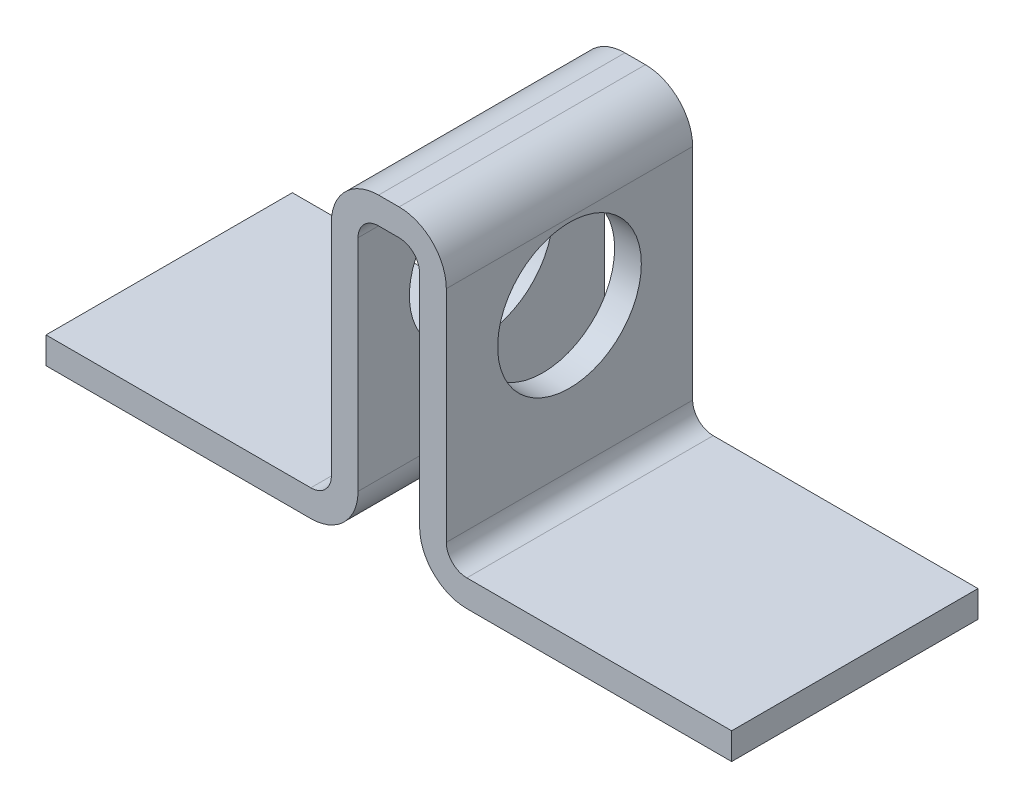
ISO-10303-21;
HEADER;
FILE_DESCRIPTION(('STEP AP214'),'2;1');
FILE_NAME('part.step','',(''),(''),'','','');
FILE_SCHEMA(('AUTOMOTIVE_DESIGN { 1 0 10303 214 1 1 1 1 }'));
ENDSEC;
DATA;
#1=APPLICATION_CONTEXT('core data for automotive mechanical design processes');
#2=APPLICATION_PROTOCOL_DEFINITION('international standard','automotive_design',2000,#1);
#3=PRODUCT_CONTEXT('',#1,'mechanical');
#4=PRODUCT('Part','Part','',(#3));
#5=PRODUCT_RELATED_PRODUCT_CATEGORY('part','',(#4));
#6=PRODUCT_DEFINITION_FORMATION('','',#4);
#7=PRODUCT_DEFINITION_CONTEXT('part definition',#1,'design');
#8=PRODUCT_DEFINITION('design','',#6,#7);
#9=PRODUCT_DEFINITION_SHAPE('','',#8);
#10=(LENGTH_UNIT() NAMED_UNIT(*) SI_UNIT(.MILLI.,.METRE.));
#11=(NAMED_UNIT(*) PLANE_ANGLE_UNIT() SI_UNIT($,.RADIAN.));
#12=(NAMED_UNIT(*) SI_UNIT($,.STERADIAN.) SOLID_ANGLE_UNIT());
#13=UNCERTAINTY_MEASURE_WITH_UNIT(LENGTH_MEASURE(1.E-05),#10,'distance_accuracy_value','');
#14=(GEOMETRIC_REPRESENTATION_CONTEXT(3) GLOBAL_UNCERTAINTY_ASSIGNED_CONTEXT((#13)) GLOBAL_UNIT_ASSIGNED_CONTEXT((#10,
#11,#12)) REPRESENTATION_CONTEXT('',''));
#15=CARTESIAN_POINT('',(0.,0.,0.));
#16=DIRECTION('',(0.,0.,1.));
#17=DIRECTION('',(1.,0.,0.));
#18=AXIS2_PLACEMENT_3D('',#15,#16,#17);
#19=CARTESIAN_POINT('',(-16.7,1.3,12.));
#20=DIRECTION('',(0.,-1.,0.));
#21=DIRECTION('',(0.,0.,-1.));
#22=AXIS2_PLACEMENT_3D('',#19,#20,#21);
#23=PLANE('',#22);
#24=DIRECTION('',(1.,0.,0.));
#25=VECTOR('',#24,1.);
#26=CARTESIAN_POINT('',(-16.7,1.3,0.));
#27=LINE('',#26,#25);
#28=CARTESIAN_POINT('',(-3.8,1.3,0.));
#29=VERTEX_POINT('',#28);
#30=CARTESIAN_POINT('',(-16.7,1.3,0.));
#31=VERTEX_POINT('',#30);
#32=EDGE_CURVE('E256',#29,#31,#27,.F.);
#33=ORIENTED_EDGE('',*,*,#32,.T.);
#34=DIRECTION('',(0.,0.,-1.));
#35=VECTOR('',#34,1.);
#36=CARTESIAN_POINT('',(-16.7,1.3,12.));
#37=LINE('',#36,#35);
#38=CARTESIAN_POINT('',(-16.7,1.3,12.));
#39=VERTEX_POINT('',#38);
#40=EDGE_CURVE('E11',#39,#31,#37,.T.);
#41=ORIENTED_EDGE('',*,*,#40,.F.);
#42=DIRECTION('',(1.,0.,0.));
#43=VECTOR('',#42,1.);
#44=CARTESIAN_POINT('',(-16.7,1.3,12.));
#45=LINE('',#44,#43);
#46=CARTESIAN_POINT('',(-3.8,1.3,12.));
#47=VERTEX_POINT('',#46);
#48=EDGE_CURVE('E162',#47,#39,#45,.F.);
#49=ORIENTED_EDGE('',*,*,#48,.F.);
#50=DIRECTION('',(0.,0.,-1.));
#51=VECTOR('',#50,1.);
#52=CARTESIAN_POINT('',(-3.8,1.3,12.));
#53=LINE('',#52,#51);
#54=EDGE_CURVE('E252',#47,#29,#53,.T.);
#55=ORIENTED_EDGE('',*,*,#54,.T.);
#56=EDGE_LOOP('',(#33,#41,#49,#55));
#57=FACE_BOUND('',#56,.T.);
#58=ADVANCED_FACE('F41',(#57),#23,.F.);
#59=CARTESIAN_POINT('',(-16.7,0.,12.));
#60=DIRECTION('',(-1.,0.,0.));
#61=DIRECTION('',(0.,0.,1.));
#62=AXIS2_PLACEMENT_3D('',#59,#60,#61);
#63=PLANE('',#62);
#64=DIRECTION('',(0.,1.,0.));
#65=VECTOR('',#64,1.);
#66=CARTESIAN_POINT('',(-16.7,0.,0.));
#67=LINE('',#66,#65);
#68=CARTESIAN_POINT('',(-16.7,0.,0.));
#69=VERTEX_POINT('',#68);
#70=EDGE_CURVE('E260',#69,#31,#67,.T.);
#71=ORIENTED_EDGE('',*,*,#70,.F.);
#72=DIRECTION('',(0.,0.,-1.));
#73=VECTOR('',#72,1.);
#74=CARTESIAN_POINT('',(-16.7,0.,12.));
#75=LINE('',#74,#73);
#76=CARTESIAN_POINT('',(-16.7,0.,12.));
#77=VERTEX_POINT('',#76);
#78=EDGE_CURVE('E51',#77,#69,#75,.T.);
#79=ORIENTED_EDGE('',*,*,#78,.F.);
#80=DIRECTION('',(0.,1.,0.));
#81=VECTOR('',#80,1.);
#82=CARTESIAN_POINT('',(-16.7,0.,12.));
#83=LINE('',#82,#81);
#84=EDGE_CURVE('E400',#77,#39,#83,.T.);
#85=ORIENTED_EDGE('',*,*,#84,.T.);
#86=ORIENTED_EDGE('',*,*,#40,.T.);
#87=EDGE_LOOP('',(#71,#79,#85,#86));
#88=FACE_BOUND('',#87,.T.);
#89=ADVANCED_FACE('F387',(#88),#63,.T.);
#90=CARTESIAN_POINT('',(-16.7,0.,12.));
#91=DIRECTION('',(0.,-1.,0.));
#92=DIRECTION('',(0.,0.,-1.));
#93=AXIS2_PLACEMENT_3D('',#90,#91,#92);
#94=PLANE('',#93);
#95=DIRECTION('',(-1.,0.,0.));
#96=VECTOR('',#95,1.);
#97=CARTESIAN_POINT('',(-16.7,0.,0.));
#98=LINE('',#97,#96);
#99=CARTESIAN_POINT('',(-3.8,0.,0.));
#100=VERTEX_POINT('',#99);
#101=EDGE_CURVE('E265',#100,#69,#98,.T.);
#102=ORIENTED_EDGE('',*,*,#101,.F.);
#103=DIRECTION('',(0.,0.,-1.));
#104=VECTOR('',#103,1.);
#105=CARTESIAN_POINT('',(-3.8,0.,12.));
#106=LINE('',#105,#104);
#107=CARTESIAN_POINT('',(-3.8,0.,12.));
#108=VERTEX_POINT('',#107);
#109=EDGE_CURVE('E373',#108,#100,#106,.T.);
#110=ORIENTED_EDGE('',*,*,#109,.F.);
#111=DIRECTION('',(-1.,0.,0.));
#112=VECTOR('',#111,1.);
#113=CARTESIAN_POINT('',(-16.7,0.,12.));
#114=LINE('',#113,#112);
#115=EDGE_CURVE('E384',#108,#77,#114,.T.);
#116=ORIENTED_EDGE('',*,*,#115,.T.);
#117=ORIENTED_EDGE('',*,*,#78,.T.);
#118=EDGE_LOOP('',(#102,#110,#116,#117));
#119=FACE_BOUND('',#118,.T.);
#120=ADVANCED_FACE('F382',(#119),#94,.T.);
#121=CARTESIAN_POINT('',(-3.8,2.3,12.));
#122=DIRECTION('',(0.,0.,-1.));
#123=DIRECTION('',(-1.,0.,0.));
#124=AXIS2_PLACEMENT_3D('',#121,#122,#123);
#125=CYLINDRICAL_SURFACE('',#124,2.3);
#126=CARTESIAN_POINT('',(-3.8,2.3,0.));
#127=DIRECTION('',(0.,0.,-1.));
#128=DIRECTION('',(1.,0.,0.));
#129=AXIS2_PLACEMENT_3D('',#126,#127,#128);
#130=CIRCLE('',#129,2.3);
#131=CARTESIAN_POINT('',(-1.5,2.3,0.));
#132=VERTEX_POINT('',#131);
#133=EDGE_CURVE('E269',#132,#100,#130,.T.);
#134=ORIENTED_EDGE('',*,*,#133,.F.);
#135=DIRECTION('',(0.,0.,-1.));
#136=VECTOR('',#135,1.);
#137=CARTESIAN_POINT('',(-1.5,2.3,12.));
#138=LINE('',#137,#136);
#139=CARTESIAN_POINT('',(-1.5,2.3,12.));
#140=VERTEX_POINT('',#139);
#141=EDGE_CURVE('E370',#140,#132,#138,.T.);
#142=ORIENTED_EDGE('',*,*,#141,.F.);
#143=CARTESIAN_POINT('',(-3.8,2.3,12.));
#144=DIRECTION('',(0.,0.,-1.));
#145=DIRECTION('',(1.,0.,0.));
#146=AXIS2_PLACEMENT_3D('',#143,#144,#145);
#147=CIRCLE('',#146,2.3);
#148=EDGE_CURVE('E397',#140,#108,#147,.T.);
#149=ORIENTED_EDGE('',*,*,#148,.T.);
#150=ORIENTED_EDGE('',*,*,#109,.T.);
#151=EDGE_LOOP('',(#134,#142,#149,#150));
#152=FACE_BOUND('',#151,.T.);
#153=ADVANCED_FACE('F394',(#152),#125,.T.);
#154=CARTESIAN_POINT('',(-1.5,2.3,12.));
#155=DIRECTION('',(1.,0.,0.));
#156=DIRECTION('',(0.,0.,-1.));
#157=AXIS2_PLACEMENT_3D('',#154,#155,#156);
#158=PLANE('',#157);
#159=CARTESIAN_POINT('',(-1.5,9.3,6.));
#160=DIRECTION('',(1.,0.,0.));
#161=DIRECTION('',(0.,0.,-1.));
#162=AXIS2_PLACEMENT_3D('',#159,#160,#161);
#163=CIRCLE('',#162,3.49999999999999);
#164=CARTESIAN_POINT('',(-1.5,9.3,2.50000000000001));
#165=VERTEX_POINT('',#164);
#166=EDGE_CURVE('E261',#165,#165,#163,.T.);
#167=ORIENTED_EDGE('',*,*,#166,.F.);
#168=EDGE_LOOP('',(#167));
#169=FACE_BOUND('',#168,.T.);
#170=DIRECTION('',(0.,-1.,0.));
#171=VECTOR('',#170,1.);
#172=CARTESIAN_POINT('',(-1.5,2.3,0.));
#173=LINE('',#172,#171);
#174=CARTESIAN_POINT('',(-1.5,13.,0.));
#175=VERTEX_POINT('',#174);
#176=EDGE_CURVE('E273',#175,#132,#173,.T.);
#177=ORIENTED_EDGE('',*,*,#176,.F.);
#178=DIRECTION('',(0.,0.,-1.));
#179=VECTOR('',#178,1.);
#180=CARTESIAN_POINT('',(-1.5,13.,12.));
#181=LINE('',#180,#179);
#182=CARTESIAN_POINT('',(-1.5,13.,12.));
#183=VERTEX_POINT('',#182);
#184=EDGE_CURVE('E367',#183,#175,#181,.T.);
#185=ORIENTED_EDGE('',*,*,#184,.F.);
#186=DIRECTION('',(0.,-1.,0.));
#187=VECTOR('',#186,1.);
#188=CARTESIAN_POINT('',(-1.5,2.3,12.));
#189=LINE('',#188,#187);
#190=EDGE_CURVE('E404',#183,#140,#189,.T.);
#191=ORIENTED_EDGE('',*,*,#190,.T.);
#192=ORIENTED_EDGE('',*,*,#141,.T.);
#193=EDGE_LOOP('',(#177,#185,#191,#192));
#194=FACE_BOUND('',#193,.T.);
#195=ADVANCED_FACE('F484',(#169,#194),#158,.T.);
#196=CARTESIAN_POINT('',(-0.5,13.,12.));
#197=DIRECTION('',(0.,0.,-1.));
#198=DIRECTION('',(-1.,0.,0.));
#199=AXIS2_PLACEMENT_3D('',#196,#197,#198);
#200=CYLINDRICAL_SURFACE('',#199,0.999999999999999);
#201=CARTESIAN_POINT('',(-0.5,13.,0.));
#202=DIRECTION('',(0.,0.,1.));
#203=DIRECTION('',(-1.,0.,0.));
#204=AXIS2_PLACEMENT_3D('',#201,#202,#203);
#205=CIRCLE('',#204,0.999999999999999);
#206=CARTESIAN_POINT('',(-0.5,14.,0.));
#207=VERTEX_POINT('',#206);
#208=EDGE_CURVE('E277',#207,#175,#205,.T.);
#209=ORIENTED_EDGE('',*,*,#208,.F.);
#210=DIRECTION('',(0.,0.,-1.));
#211=VECTOR('',#210,1.);
#212=CARTESIAN_POINT('',(-0.5,14.,12.));
#213=LINE('',#212,#211);
#214=CARTESIAN_POINT('',(-0.5,14.,12.));
#215=VERTEX_POINT('',#214);
#216=EDGE_CURVE('E364',#215,#207,#213,.T.);
#217=ORIENTED_EDGE('',*,*,#216,.F.);
#218=CARTESIAN_POINT('',(-0.5,13.,12.));
#219=DIRECTION('',(0.,0.,1.));
#220=DIRECTION('',(-1.,0.,0.));
#221=AXIS2_PLACEMENT_3D('',#218,#219,#220);
#222=CIRCLE('',#221,0.999999999999999);
#223=EDGE_CURVE('E412',#215,#183,#222,.T.);
#224=ORIENTED_EDGE('',*,*,#223,.T.);
#225=ORIENTED_EDGE('',*,*,#184,.T.);
#226=EDGE_LOOP('',(#209,#217,#224,#225));
#227=FACE_BOUND('',#226,.T.);
#228=ADVANCED_FACE('F487',(#227),#200,.F.);
#229=CARTESIAN_POINT('',(-0.5,14.,12.));
#230=DIRECTION('',(0.,-1.,0.));
#231=DIRECTION('',(0.,0.,-1.));
#232=AXIS2_PLACEMENT_3D('',#229,#230,#231);
#233=PLANE('',#232);
#234=DIRECTION('',(-1.,0.,0.));
#235=VECTOR('',#234,1.);
#236=CARTESIAN_POINT('',(-0.5,14.,0.));
#237=LINE('',#236,#235);
#238=CARTESIAN_POINT('',(0.5,14.,0.));
#239=VERTEX_POINT('',#238);
#240=EDGE_CURVE('E281',#239,#207,#237,.T.);
#241=ORIENTED_EDGE('',*,*,#240,.F.);
#242=DIRECTION('',(0.,0.,-1.));
#243=VECTOR('',#242,1.);
#244=CARTESIAN_POINT('',(0.5,14.,12.));
#245=LINE('',#244,#243);
#246=CARTESIAN_POINT('',(0.5,14.,12.));
#247=VERTEX_POINT('',#246);
#248=EDGE_CURVE('E361',#247,#239,#245,.T.);
#249=ORIENTED_EDGE('',*,*,#248,.F.);
#250=DIRECTION('',(-1.,0.,0.));
#251=VECTOR('',#250,1.);
#252=CARTESIAN_POINT('',(-0.5,14.,12.));
#253=LINE('',#252,#251);
#254=EDGE_CURVE('E416',#247,#215,#253,.T.);
#255=ORIENTED_EDGE('',*,*,#254,.T.);
#256=ORIENTED_EDGE('',*,*,#216,.T.);
#257=EDGE_LOOP('',(#241,#249,#255,#256));
#258=FACE_BOUND('',#257,.T.);
#259=ADVANCED_FACE('F491',(#258),#233,.T.);
#260=CARTESIAN_POINT('',(0.5,13.,12.));
#261=DIRECTION('',(0.,0.,-1.));
#262=DIRECTION('',(-1.,0.,0.));
#263=AXIS2_PLACEMENT_3D('',#260,#261,#262);
#264=CYLINDRICAL_SURFACE('',#263,0.999999999999999);
#265=CARTESIAN_POINT('',(0.5,13.,0.));
#266=DIRECTION('',(0.,0.,1.));
#267=DIRECTION('',(1.,0.,0.));
#268=AXIS2_PLACEMENT_3D('',#265,#266,#267);
#269=CIRCLE('',#268,0.999999999999999);
#270=CARTESIAN_POINT('',(1.5,13.,0.));
#271=VERTEX_POINT('',#270);
#272=EDGE_CURVE('E285',#271,#239,#269,.T.);
#273=ORIENTED_EDGE('',*,*,#272,.F.);
#274=DIRECTION('',(0.,0.,-1.));
#275=VECTOR('',#274,1.);
#276=CARTESIAN_POINT('',(1.5,13.,12.));
#277=LINE('',#276,#275);
#278=CARTESIAN_POINT('',(1.5,13.,12.));
#279=VERTEX_POINT('',#278);
#280=EDGE_CURVE('E359',#279,#271,#277,.T.);
#281=ORIENTED_EDGE('',*,*,#280,.F.);
#282=CARTESIAN_POINT('',(0.5,13.,12.));
#283=DIRECTION('',(0.,0.,1.));
#284=DIRECTION('',(1.,0.,0.));
#285=AXIS2_PLACEMENT_3D('',#282,#283,#284);
#286=CIRCLE('',#285,0.999999999999999);
#287=EDGE_CURVE('E420',#279,#247,#286,.T.);
#288=ORIENTED_EDGE('',*,*,#287,.T.);
#289=ORIENTED_EDGE('',*,*,#248,.T.);
#290=EDGE_LOOP('',(#273,#281,#288,#289));
#291=FACE_BOUND('',#290,.T.);
#292=ADVANCED_FACE('F495',(#291),#264,.F.);
#293=CARTESIAN_POINT('',(1.5,2.3,12.));
#294=DIRECTION('',(-1.,0.,0.));
#295=DIRECTION('',(0.,0.,1.));
#296=AXIS2_PLACEMENT_3D('',#293,#294,#295);
#297=PLANE('',#296);
#298=CARTESIAN_POINT('',(1.5,9.3,6.));
#299=DIRECTION('',(-1.,0.,0.));
#300=DIRECTION('',(0.,0.,1.));
#301=AXIS2_PLACEMENT_3D('',#298,#299,#300);
#302=CIRCLE('',#301,3.49999999999999);
#303=CARTESIAN_POINT('',(1.5,9.3,9.49999999999999));
#304=VERTEX_POINT('',#303);
#305=EDGE_CURVE('E688',#304,#304,#302,.T.);
#306=ORIENTED_EDGE('',*,*,#305,.F.);
#307=EDGE_LOOP('',(#306));
#308=FACE_BOUND('',#307,.T.);
#309=DIRECTION('',(0.,1.,0.));
#310=VECTOR('',#309,1.);
#311=CARTESIAN_POINT('',(1.5,2.3,0.));
#312=LINE('',#311,#310);
#313=CARTESIAN_POINT('',(1.5,2.3,0.));
#314=VERTEX_POINT('',#313);
#315=EDGE_CURVE('E289',#314,#271,#312,.T.);
#316=ORIENTED_EDGE('',*,*,#315,.F.);
#317=DIRECTION('',(0.,0.,-1.));
#318=VECTOR('',#317,1.);
#319=CARTESIAN_POINT('',(1.5,2.3,12.));
#320=LINE('',#319,#318);
#321=CARTESIAN_POINT('',(1.5,2.3,12.));
#322=VERTEX_POINT('',#321);
#323=EDGE_CURVE('E356',#322,#314,#320,.T.);
#324=ORIENTED_EDGE('',*,*,#323,.F.);
#325=DIRECTION('',(0.,1.,0.));
#326=VECTOR('',#325,1.);
#327=CARTESIAN_POINT('',(1.5,2.3,12.));
#328=LINE('',#327,#326);
#329=EDGE_CURVE('E424',#322,#279,#328,.T.);
#330=ORIENTED_EDGE('',*,*,#329,.T.);
#331=ORIENTED_EDGE('',*,*,#280,.T.);
#332=EDGE_LOOP('',(#316,#324,#330,#331));
#333=FACE_BOUND('',#332,.T.);
#334=ADVANCED_FACE('F499',(#308,#333),#297,.T.);
#335=CARTESIAN_POINT('',(3.8,2.3,12.));
#336=DIRECTION('',(0.,0.,-1.));
#337=DIRECTION('',(-1.,0.,0.));
#338=AXIS2_PLACEMENT_3D('',#335,#336,#337);
#339=CYLINDRICAL_SURFACE('',#338,2.3);
#340=CARTESIAN_POINT('',(3.8,2.3,0.));
#341=DIRECTION('',(0.,0.,-1.));
#342=DIRECTION('',(1.,0.,0.));
#343=AXIS2_PLACEMENT_3D('',#340,#341,#342);
#344=CIRCLE('',#343,2.3);
#345=CARTESIAN_POINT('',(3.8,0.,0.));
#346=VERTEX_POINT('',#345);
#347=EDGE_CURVE('E292',#346,#314,#344,.T.);
#348=ORIENTED_EDGE('',*,*,#347,.F.);
#349=DIRECTION('',(0.,0.,-1.));
#350=VECTOR('',#349,1.);
#351=CARTESIAN_POINT('',(3.8,0.,12.));
#352=LINE('',#351,#350);
#353=CARTESIAN_POINT('',(3.8,0.,12.));
#354=VERTEX_POINT('',#353);
#355=EDGE_CURVE('E353',#354,#346,#352,.T.);
#356=ORIENTED_EDGE('',*,*,#355,.F.);
#357=CARTESIAN_POINT('',(3.8,2.3,12.));
#358=DIRECTION('',(0.,0.,-1.));
#359=DIRECTION('',(1.,0.,0.));
#360=AXIS2_PLACEMENT_3D('',#357,#358,#359);
#361=CIRCLE('',#360,2.3);
#362=EDGE_CURVE('E428',#354,#322,#361,.T.);
#363=ORIENTED_EDGE('',*,*,#362,.T.);
#364=ORIENTED_EDGE('',*,*,#323,.T.);
#365=EDGE_LOOP('',(#348,#356,#363,#364));
#366=FACE_BOUND('',#365,.T.);
#367=ADVANCED_FACE('F503',(#366),#339,.T.);
#368=CARTESIAN_POINT('',(16.7,0.,12.));
#369=DIRECTION('',(0.,-1.,0.));
#370=DIRECTION('',(0.,0.,-1.));
#371=AXIS2_PLACEMENT_3D('',#368,#369,#370);
#372=PLANE('',#371);
#373=DIRECTION('',(-1.,0.,0.));
#374=VECTOR('',#373,1.);
#375=CARTESIAN_POINT('',(16.7,0.,0.));
#376=LINE('',#375,#374);
#377=CARTESIAN_POINT('',(16.7,0.,0.));
#378=VERTEX_POINT('',#377);
#379=EDGE_CURVE('E296',#378,#346,#376,.T.);
#380=ORIENTED_EDGE('',*,*,#379,.F.);
#381=DIRECTION('',(0.,0.,-1.));
#382=VECTOR('',#381,1.);
#383=CARTESIAN_POINT('',(16.7,0.,12.));
#384=LINE('',#383,#382);
#385=CARTESIAN_POINT('',(16.7,0.,12.));
#386=VERTEX_POINT('',#385);
#387=EDGE_CURVE('E350',#386,#378,#384,.T.);
#388=ORIENTED_EDGE('',*,*,#387,.F.);
#389=DIRECTION('',(-1.,0.,0.));
#390=VECTOR('',#389,1.);
#391=CARTESIAN_POINT('',(16.7,0.,12.));
#392=LINE('',#391,#390);
#393=EDGE_CURVE('E432',#386,#354,#392,.T.);
#394=ORIENTED_EDGE('',*,*,#393,.T.);
#395=ORIENTED_EDGE('',*,*,#355,.T.);
#396=EDGE_LOOP('',(#380,#388,#394,#395));
#397=FACE_BOUND('',#396,.T.);
#398=ADVANCED_FACE('F507',(#397),#372,.T.);
#399=CARTESIAN_POINT('',(16.7,1.3,12.));
#400=DIRECTION('',(1.,0.,0.));
#401=DIRECTION('',(0.,0.,-1.));
#402=AXIS2_PLACEMENT_3D('',#399,#400,#401);
#403=PLANE('',#402);
#404=DIRECTION('',(0.,-1.,0.));
#405=VECTOR('',#404,1.);
#406=CARTESIAN_POINT('',(16.7,1.3,0.));
#407=LINE('',#406,#405);
#408=CARTESIAN_POINT('',(16.7,1.3,0.));
#409=VERTEX_POINT('',#408);
#410=EDGE_CURVE('E300',#409,#378,#407,.T.);
#411=ORIENTED_EDGE('',*,*,#410,.F.);
#412=DIRECTION('',(0.,0.,-1.));
#413=VECTOR('',#412,1.);
#414=CARTESIAN_POINT('',(16.7,1.3,12.));
#415=LINE('',#414,#413);
#416=CARTESIAN_POINT('',(16.7,1.3,12.));
#417=VERTEX_POINT('',#416);
#418=EDGE_CURVE('E347',#417,#409,#415,.T.);
#419=ORIENTED_EDGE('',*,*,#418,.F.);
#420=DIRECTION('',(0.,-1.,0.));
#421=VECTOR('',#420,1.);
#422=CARTESIAN_POINT('',(16.7,1.3,12.));
#423=LINE('',#422,#421);
#424=EDGE_CURVE('E436',#417,#386,#423,.T.);
#425=ORIENTED_EDGE('',*,*,#424,.T.);
#426=ORIENTED_EDGE('',*,*,#387,.T.);
#427=EDGE_LOOP('',(#411,#419,#425,#426));
#428=FACE_BOUND('',#427,.T.);
#429=ADVANCED_FACE('F511',(#428),#403,.T.);
#430=CARTESIAN_POINT('',(16.7,1.3,12.));
#431=DIRECTION('',(0.,-1.,0.));
#432=DIRECTION('',(0.,0.,-1.));
#433=AXIS2_PLACEMENT_3D('',#430,#431,#432);
#434=PLANE('',#433);
#435=DIRECTION('',(1.,0.,0.));
#436=VECTOR('',#435,1.);
#437=CARTESIAN_POINT('',(16.7,1.3,0.));
#438=LINE('',#437,#436);
#439=CARTESIAN_POINT('',(3.8,1.3,0.));
#440=VERTEX_POINT('',#439);
#441=EDGE_CURVE('E304',#409,#440,#438,.F.);
#442=ORIENTED_EDGE('',*,*,#441,.T.);
#443=DIRECTION('',(0.,0.,-1.));
#444=VECTOR('',#443,1.);
#445=CARTESIAN_POINT('',(3.8,1.3,12.));
#446=LINE('',#445,#444);
#447=CARTESIAN_POINT('',(3.8,1.3,12.));
#448=VERTEX_POINT('',#447);
#449=EDGE_CURVE('E343',#448,#440,#446,.T.);
#450=ORIENTED_EDGE('',*,*,#449,.F.);
#451=DIRECTION('',(1.,0.,0.));
#452=VECTOR('',#451,1.);
#453=CARTESIAN_POINT('',(16.7,1.3,12.));
#454=LINE('',#453,#452);
#455=EDGE_CURVE('E439',#417,#448,#454,.F.);
#456=ORIENTED_EDGE('',*,*,#455,.F.);
#457=ORIENTED_EDGE('',*,*,#418,.T.);
#458=EDGE_LOOP('',(#442,#450,#456,#457));
#459=FACE_BOUND('',#458,.T.);
#460=ADVANCED_FACE('F515',(#459),#434,.F.);
#461=CARTESIAN_POINT('',(3.8,2.3,12.));
#462=DIRECTION('',(0.,0.,-1.));
#463=DIRECTION('',(-1.,0.,0.));
#464=AXIS2_PLACEMENT_3D('',#461,#462,#463);
#465=CYLINDRICAL_SURFACE('',#464,1.);
#466=CARTESIAN_POINT('',(3.8,2.3,0.));
#467=DIRECTION('',(0.,0.,1.));
#468=DIRECTION('',(1.,0.,0.));
#469=AXIS2_PLACEMENT_3D('',#466,#467,#468);
#470=CIRCLE('',#469,1.);
#471=CARTESIAN_POINT('',(2.8,2.3,0.));
#472=VERTEX_POINT('',#471);
#473=EDGE_CURVE('E307',#440,#472,#470,.F.);
#474=ORIENTED_EDGE('',*,*,#473,.T.);
#475=DIRECTION('',(0.,0.,-1.));
#476=VECTOR('',#475,1.);
#477=CARTESIAN_POINT('',(2.8,2.3,12.));
#478=LINE('',#477,#476);
#479=CARTESIAN_POINT('',(2.8,2.3,12.));
#480=VERTEX_POINT('',#479);
#481=EDGE_CURVE('E339',#480,#472,#478,.T.);
#482=ORIENTED_EDGE('',*,*,#481,.F.);
#483=CARTESIAN_POINT('',(3.8,2.3,12.));
#484=DIRECTION('',(0.,0.,1.));
#485=DIRECTION('',(1.,0.,0.));
#486=AXIS2_PLACEMENT_3D('',#483,#484,#485);
#487=CIRCLE('',#486,1.);
#488=EDGE_CURVE('E442',#448,#480,#487,.F.);
#489=ORIENTED_EDGE('',*,*,#488,.F.);
#490=ORIENTED_EDGE('',*,*,#449,.T.);
#491=EDGE_LOOP('',(#474,#482,#489,#490));
#492=FACE_BOUND('',#491,.T.);
#493=ADVANCED_FACE('F519',(#492),#465,.F.);
#494=CARTESIAN_POINT('',(2.8,2.3,12.));
#495=DIRECTION('',(-1.,0.,0.));
#496=DIRECTION('',(0.,0.,1.));
#497=AXIS2_PLACEMENT_3D('',#494,#495,#496);
#498=PLANE('',#497);
#499=CARTESIAN_POINT('',(2.8,9.3,6.));
#500=DIRECTION('',(1.,0.,0.));
#501=DIRECTION('',(0.,0.,-1.));
#502=AXIS2_PLACEMENT_3D('',#499,#500,#501);
#503=CIRCLE('',#502,3.49999999999999);
#504=CARTESIAN_POINT('',(2.8,9.3,2.50000000000001));
#505=VERTEX_POINT('',#504);
#506=EDGE_CURVE('E691',#505,#505,#503,.T.);
#507=ORIENTED_EDGE('',*,*,#506,.F.);
#508=EDGE_LOOP('',(#507));
#509=FACE_BOUND('',#508,.T.);
#510=DIRECTION('',(0.,1.,0.));
#511=VECTOR('',#510,1.);
#512=CARTESIAN_POINT('',(2.8,2.3,0.));
#513=LINE('',#512,#511);
#514=CARTESIAN_POINT('',(2.8,13.,0.));
#515=VERTEX_POINT('',#514);
#516=EDGE_CURVE('E310',#472,#515,#513,.T.);
#517=ORIENTED_EDGE('',*,*,#516,.T.);
#518=DIRECTION('',(0.,0.,-1.));
#519=VECTOR('',#518,1.);
#520=CARTESIAN_POINT('',(2.8,13.,12.));
#521=LINE('',#520,#519);
#522=CARTESIAN_POINT('',(2.8,13.,12.));
#523=VERTEX_POINT('',#522);
#524=EDGE_CURVE('E335',#523,#515,#521,.T.);
#525=ORIENTED_EDGE('',*,*,#524,.F.);
#526=DIRECTION('',(0.,1.,0.));
#527=VECTOR('',#526,1.);
#528=CARTESIAN_POINT('',(2.8,2.3,12.));
#529=LINE('',#528,#527);
#530=EDGE_CURVE('E445',#480,#523,#529,.T.);
#531=ORIENTED_EDGE('',*,*,#530,.F.);
#532=ORIENTED_EDGE('',*,*,#481,.T.);
#533=EDGE_LOOP('',(#517,#525,#531,#532));
#534=FACE_BOUND('',#533,.T.);
#535=ADVANCED_FACE('F523',(#509,#534),#498,.F.);
#536=CARTESIAN_POINT('',(0.5,13.,12.));
#537=DIRECTION('',(0.,0.,-1.));
#538=DIRECTION('',(-1.,0.,0.));
#539=AXIS2_PLACEMENT_3D('',#536,#537,#538);
#540=CYLINDRICAL_SURFACE('',#539,2.3);
#541=CARTESIAN_POINT('',(0.5,13.,0.));
#542=DIRECTION('',(0.,0.,1.));
#543=DIRECTION('',(1.,0.,0.));
#544=AXIS2_PLACEMENT_3D('',#541,#542,#543);
#545=CIRCLE('',#544,2.3);
#546=CARTESIAN_POINT('',(0.5,15.3,0.));
#547=VERTEX_POINT('',#546);
#548=EDGE_CURVE('E313',#515,#547,#545,.T.);
#549=ORIENTED_EDGE('',*,*,#548,.T.);
#550=DIRECTION('',(0.,0.,-1.));
#551=VECTOR('',#550,1.);
#552=CARTESIAN_POINT('',(0.5,15.3,12.));
#553=LINE('',#552,#551);
#554=CARTESIAN_POINT('',(0.5,15.3,12.));
#555=VERTEX_POINT('',#554);
#556=EDGE_CURVE('E331',#555,#547,#553,.T.);
#557=ORIENTED_EDGE('',*,*,#556,.F.);
#558=CARTESIAN_POINT('',(0.5,13.,12.));
#559=DIRECTION('',(0.,0.,1.));
#560=DIRECTION('',(1.,0.,0.));
#561=AXIS2_PLACEMENT_3D('',#558,#559,#560);
#562=CIRCLE('',#561,2.3);
#563=EDGE_CURVE('E448',#523,#555,#562,.T.);
#564=ORIENTED_EDGE('',*,*,#563,.F.);
#565=ORIENTED_EDGE('',*,*,#524,.T.);
#566=EDGE_LOOP('',(#549,#557,#564,#565));
#567=FACE_BOUND('',#566,.T.);
#568=ADVANCED_FACE('F456',(#567),#540,.T.);
#569=CARTESIAN_POINT('',(-0.5,15.3,12.));
#570=DIRECTION('',(0.,-1.,0.));
#571=DIRECTION('',(0.,0.,-1.));
#572=AXIS2_PLACEMENT_3D('',#569,#570,#571);
#573=PLANE('',#572);
#574=DIRECTION('',(1.,0.,0.));
#575=VECTOR('',#574,1.);
#576=CARTESIAN_POINT('',(-0.5,15.3,0.));
#577=LINE('',#576,#575);
#578=CARTESIAN_POINT('',(-0.499999999999999,15.3,0.));
#579=VERTEX_POINT('',#578);
#580=EDGE_CURVE('E316',#547,#579,#577,.F.);
#581=ORIENTED_EDGE('',*,*,#580,.T.);
#582=DIRECTION('',(0.,0.,-1.));
#583=VECTOR('',#582,1.);
#584=CARTESIAN_POINT('',(-0.499999999999999,15.3,12.));
#585=LINE('',#584,#583);
#586=CARTESIAN_POINT('',(-0.499999999999999,15.3,12.));
#587=VERTEX_POINT('',#586);
#588=EDGE_CURVE('E243',#587,#579,#585,.T.);
#589=ORIENTED_EDGE('',*,*,#588,.F.);
#590=DIRECTION('',(1.,0.,0.));
#591=VECTOR('',#590,1.);
#592=CARTESIAN_POINT('',(-0.5,15.3,12.));
#593=LINE('',#592,#591);
#594=EDGE_CURVE('E232',#555,#587,#593,.F.);
#595=ORIENTED_EDGE('',*,*,#594,.F.);
#596=ORIENTED_EDGE('',*,*,#556,.T.);
#597=EDGE_LOOP('',(#581,#589,#595,#596));
#598=FACE_BOUND('',#597,.T.);
#599=ADVANCED_FACE('F460',(#598),#573,.F.);
#600=CARTESIAN_POINT('',(-0.5,13.,12.));
#601=DIRECTION('',(0.,0.,-1.));
#602=DIRECTION('',(-1.,0.,0.));
#603=AXIS2_PLACEMENT_3D('',#600,#601,#602);
#604=CYLINDRICAL_SURFACE('',#603,2.3);
#605=CARTESIAN_POINT('',(-0.5,13.,0.));
#606=DIRECTION('',(0.,0.,1.));
#607=DIRECTION('',(1.,0.,0.));
#608=AXIS2_PLACEMENT_3D('',#605,#606,#607);
#609=CIRCLE('',#608,2.3);
#610=CARTESIAN_POINT('',(-2.8,13.,0.));
#611=VERTEX_POINT('',#610);
#612=EDGE_CURVE('E241',#579,#611,#609,.T.);
#613=ORIENTED_EDGE('',*,*,#612,.T.);
#614=DIRECTION('',(0.,0.,-1.));
#615=VECTOR('',#614,1.);
#616=CARTESIAN_POINT('',(-2.8,13.,12.));
#617=LINE('',#616,#615);
#618=CARTESIAN_POINT('',(-2.8,13.,12.));
#619=VERTEX_POINT('',#618);
#620=EDGE_CURVE('E238',#619,#611,#617,.T.);
#621=ORIENTED_EDGE('',*,*,#620,.F.);
#622=CARTESIAN_POINT('',(-0.5,13.,12.));
#623=DIRECTION('',(0.,0.,1.));
#624=DIRECTION('',(1.,0.,0.));
#625=AXIS2_PLACEMENT_3D('',#622,#623,#624);
#626=CIRCLE('',#625,2.3);
#627=EDGE_CURVE('E226',#587,#619,#626,.T.);
#628=ORIENTED_EDGE('',*,*,#627,.F.);
#629=ORIENTED_EDGE('',*,*,#588,.T.);
#630=EDGE_LOOP('',(#613,#621,#628,#629));
#631=FACE_BOUND('',#630,.T.);
#632=ADVANCED_FACE('F239',(#631),#604,.T.);
#633=CARTESIAN_POINT('',(-2.8,2.3,12.));
#634=DIRECTION('',(1.,0.,0.));
#635=DIRECTION('',(0.,0.,-1.));
#636=AXIS2_PLACEMENT_3D('',#633,#634,#635);
#637=PLANE('',#636);
#638=CARTESIAN_POINT('',(-2.8,9.3,6.));
#639=DIRECTION('',(1.,0.,0.));
#640=DIRECTION('',(0.,0.,-1.));
#641=AXIS2_PLACEMENT_3D('',#638,#639,#640);
#642=CIRCLE('',#641,3.49999999999999);
#643=CARTESIAN_POINT('',(-2.8,9.3,2.50000000000001));
#644=VERTEX_POINT('',#643);
#645=EDGE_CURVE('E44',#644,#644,#642,.T.);
#646=ORIENTED_EDGE('',*,*,#645,.T.);
#647=EDGE_LOOP('',(#646));
#648=FACE_BOUND('',#647,.T.);
#649=DIRECTION('',(0.,1.,0.));
#650=VECTOR('',#649,1.);
#651=CARTESIAN_POINT('',(-2.8,2.3,0.));
#652=LINE('',#651,#650);
#653=CARTESIAN_POINT('',(-2.8,2.3,0.));
#654=VERTEX_POINT('',#653);
#655=EDGE_CURVE('E146',#611,#654,#652,.F.);
#656=ORIENTED_EDGE('',*,*,#655,.T.);
#657=DIRECTION('',(0.,0.,-1.));
#658=VECTOR('',#657,1.);
#659=CARTESIAN_POINT('',(-2.8,2.3,12.));
#660=LINE('',#659,#658);
#661=CARTESIAN_POINT('',(-2.8,2.3,12.));
#662=VERTEX_POINT('',#661);
#663=EDGE_CURVE('E244',#662,#654,#660,.T.);
#664=ORIENTED_EDGE('',*,*,#663,.F.);
#665=DIRECTION('',(0.,1.,0.));
#666=VECTOR('',#665,1.);
#667=CARTESIAN_POINT('',(-2.8,2.3,12.));
#668=LINE('',#667,#666);
#669=EDGE_CURVE('E230',#619,#662,#668,.F.);
#670=ORIENTED_EDGE('',*,*,#669,.F.);
#671=ORIENTED_EDGE('',*,*,#620,.T.);
#672=EDGE_LOOP('',(#656,#664,#670,#671));
#673=FACE_BOUND('',#672,.T.);
#674=ADVANCED_FACE('F246',(#648,#673),#637,.F.);
#675=CARTESIAN_POINT('',(-3.8,2.3,12.));
#676=DIRECTION('',(0.,0.,-1.));
#677=DIRECTION('',(-1.,0.,0.));
#678=AXIS2_PLACEMENT_3D('',#675,#676,#677);
#679=CYLINDRICAL_SURFACE('',#678,1.);
#680=CARTESIAN_POINT('',(-3.8,2.3,0.));
#681=DIRECTION('',(0.,0.,1.));
#682=DIRECTION('',(1.,0.,0.));
#683=AXIS2_PLACEMENT_3D('',#680,#681,#682);
#684=CIRCLE('',#683,1.);
#685=EDGE_CURVE('E153',#654,#29,#684,.F.);
#686=ORIENTED_EDGE('',*,*,#685,.T.);
#687=ORIENTED_EDGE('',*,*,#54,.F.);
#688=CARTESIAN_POINT('',(-3.8,2.3,12.));
#689=DIRECTION('',(0.,0.,1.));
#690=DIRECTION('',(1.,0.,0.));
#691=AXIS2_PLACEMENT_3D('',#688,#689,#690);
#692=CIRCLE('',#691,1.);
#693=EDGE_CURVE('E62',#662,#47,#692,.F.);
#694=ORIENTED_EDGE('',*,*,#693,.F.);
#695=ORIENTED_EDGE('',*,*,#663,.T.);
#696=EDGE_LOOP('',(#686,#687,#694,#695));
#697=FACE_BOUND('',#696,.T.);
#698=ADVANCED_FACE('F462',(#697),#679,.F.);
#699=CARTESIAN_POINT('',(-3.8,2.3,12.));
#700=DIRECTION('',(0.,0.,-1.));
#701=DIRECTION('',(-1.,0.,0.));
#702=AXIS2_PLACEMENT_3D('',#699,#700,#701);
#703=PLANE('',#702);
#704=ORIENTED_EDGE('',*,*,#48,.T.);
#705=ORIENTED_EDGE('',*,*,#84,.F.);
#706=ORIENTED_EDGE('',*,*,#115,.F.);
#707=ORIENTED_EDGE('',*,*,#148,.F.);
#708=ORIENTED_EDGE('',*,*,#190,.F.);
#709=ORIENTED_EDGE('',*,*,#223,.F.);
#710=ORIENTED_EDGE('',*,*,#254,.F.);
#711=ORIENTED_EDGE('',*,*,#287,.F.);
#712=ORIENTED_EDGE('',*,*,#329,.F.);
#713=ORIENTED_EDGE('',*,*,#362,.F.);
#714=ORIENTED_EDGE('',*,*,#393,.F.);
#715=ORIENTED_EDGE('',*,*,#424,.F.);
#716=ORIENTED_EDGE('',*,*,#455,.T.);
#717=ORIENTED_EDGE('',*,*,#488,.T.);
#718=ORIENTED_EDGE('',*,*,#530,.T.);
#719=ORIENTED_EDGE('',*,*,#563,.T.);
#720=ORIENTED_EDGE('',*,*,#594,.T.);
#721=ORIENTED_EDGE('',*,*,#627,.T.);
#722=ORIENTED_EDGE('',*,*,#669,.T.);
#723=ORIENTED_EDGE('',*,*,#693,.T.);
#724=EDGE_LOOP('',(#704,#705,#706,#707,#708,#709,#710,#711,#712,#713,#714,#715,#716,#717,#718,
#719,#720,#721,#722,#723));
#725=FACE_BOUND('',#724,.T.);
#726=ADVANCED_FACE('F228',(#725),#703,.F.);
#727=CARTESIAN_POINT('',(-3.8,2.3,0.));
#728=DIRECTION('',(0.,0.,-1.));
#729=DIRECTION('',(-1.,0.,0.));
#730=AXIS2_PLACEMENT_3D('',#727,#728,#729);
#731=PLANE('',#730);
#732=ORIENTED_EDGE('',*,*,#32,.F.);
#733=ORIENTED_EDGE('',*,*,#685,.F.);
#734=ORIENTED_EDGE('',*,*,#655,.F.);
#735=ORIENTED_EDGE('',*,*,#612,.F.);
#736=ORIENTED_EDGE('',*,*,#580,.F.);
#737=ORIENTED_EDGE('',*,*,#548,.F.);
#738=ORIENTED_EDGE('',*,*,#516,.F.);
#739=ORIENTED_EDGE('',*,*,#473,.F.);
#740=ORIENTED_EDGE('',*,*,#441,.F.);
#741=ORIENTED_EDGE('',*,*,#410,.T.);
#742=ORIENTED_EDGE('',*,*,#379,.T.);
#743=ORIENTED_EDGE('',*,*,#347,.T.);
#744=ORIENTED_EDGE('',*,*,#315,.T.);
#745=ORIENTED_EDGE('',*,*,#272,.T.);
#746=ORIENTED_EDGE('',*,*,#240,.T.);
#747=ORIENTED_EDGE('',*,*,#208,.T.);
#748=ORIENTED_EDGE('',*,*,#176,.T.);
#749=ORIENTED_EDGE('',*,*,#133,.T.);
#750=ORIENTED_EDGE('',*,*,#101,.T.);
#751=ORIENTED_EDGE('',*,*,#70,.T.);
#752=EDGE_LOOP('',(#732,#733,#734,#735,#736,#737,#738,#739,#740,#741,#742,#743,#744,#745,#746,
#747,#748,#749,#750,#751));
#753=FACE_BOUND('',#752,.T.);
#754=ADVANCED_FACE('F390',(#753),#731,.T.);
#755=CARTESIAN_POINT('',(2.8,9.3,6.));
#756=DIRECTION('',(1.,0.,0.));
#757=DIRECTION('',(0.,0.,-1.));
#758=AXIS2_PLACEMENT_3D('',#755,#756,#757);
#759=CYLINDRICAL_SURFACE('',#758,3.49999999999999);
#760=ORIENTED_EDGE('',*,*,#166,.T.);
#761=EDGE_LOOP('',(#760));
#762=FACE_BOUND('',#761,.T.);
#763=ORIENTED_EDGE('',*,*,#645,.F.);
#764=EDGE_LOOP('',(#763));
#765=FACE_BOUND('',#764,.T.);
#766=ADVANCED_FACE('F629',(#762,#765),#759,.F.);
#767=ORIENTED_EDGE('',*,*,#305,.T.);
#768=EDGE_LOOP('',(#767));
#769=FACE_BOUND('',#768,.T.);
#770=ORIENTED_EDGE('',*,*,#506,.T.);
#771=EDGE_LOOP('',(#770));
#772=FACE_BOUND('',#771,.T.);
#773=ADVANCED_FACE('F672',(#769,#772),#759,.F.);
#774=CLOSED_SHELL('',(#58,#89,#120,#153,#195,#228,#259,#292,#334,#367,#398,#429,#460,#493,#535,
#568,#599,#632,#674,#698,#726,#754,#766,#773));
#775=MANIFOLD_SOLID_BREP('B2',#774);
#776=ADVANCED_BREP_SHAPE_REPRESENTATION('',(#18,#775),#14);
#777=SHAPE_DEFINITION_REPRESENTATION(#9,#776);
ENDSEC;
END-ISO-10303-21;
